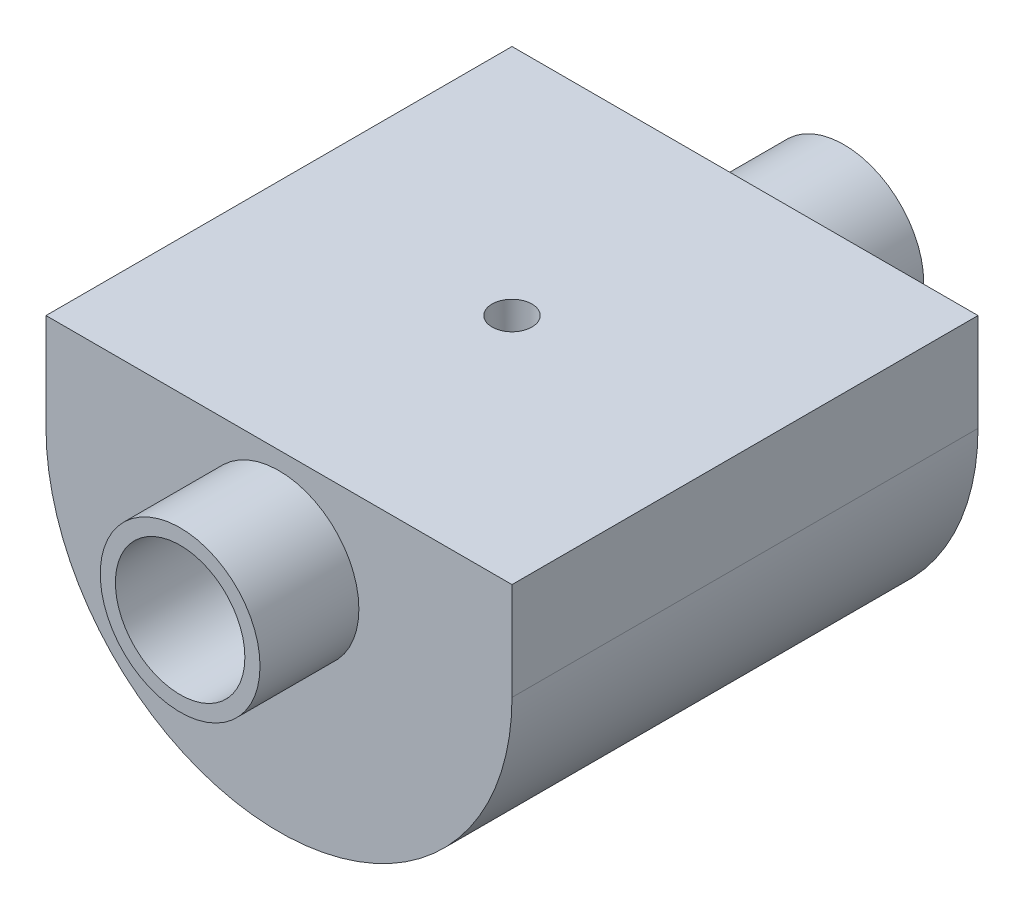
ISO-10303-21;
HEADER;
FILE_DESCRIPTION(('STEP AP214'),'2;1');
FILE_NAME('part.step','',(''),(''),'','','');
FILE_SCHEMA(('AUTOMOTIVE_DESIGN { 1 0 10303 214 1 1 1 1 }'));
ENDSEC;
DATA;
#1=APPLICATION_CONTEXT('core data for automotive mechanical design processes');
#2=APPLICATION_PROTOCOL_DEFINITION('international standard','automotive_design',2000,#1);
#3=PRODUCT_CONTEXT('',#1,'mechanical');
#4=PRODUCT('Part','Part','',(#3));
#5=PRODUCT_RELATED_PRODUCT_CATEGORY('part','',(#4));
#6=PRODUCT_DEFINITION_FORMATION('','',#4);
#7=PRODUCT_DEFINITION_CONTEXT('part definition',#1,'design');
#8=PRODUCT_DEFINITION('design','',#6,#7);
#9=PRODUCT_DEFINITION_SHAPE('','',#8);
#10=(LENGTH_UNIT() NAMED_UNIT(*) SI_UNIT(.MILLI.,.METRE.));
#11=(NAMED_UNIT(*) PLANE_ANGLE_UNIT() SI_UNIT($,.RADIAN.));
#12=(NAMED_UNIT(*) SI_UNIT($,.STERADIAN.) SOLID_ANGLE_UNIT());
#13=UNCERTAINTY_MEASURE_WITH_UNIT(LENGTH_MEASURE(1.E-05),#10,'distance_accuracy_value','');
#14=(GEOMETRIC_REPRESENTATION_CONTEXT(3) GLOBAL_UNCERTAINTY_ASSIGNED_CONTEXT((#13)) GLOBAL_UNIT_ASSIGNED_CONTEXT((#10,
#11,#12)) REPRESENTATION_CONTEXT('',''));
#15=CARTESIAN_POINT('',(0.,0.,0.));
#16=DIRECTION('',(0.,0.,1.));
#17=DIRECTION('',(1.,0.,0.));
#18=AXIS2_PLACEMENT_3D('',#15,#16,#17);
#19=CARTESIAN_POINT('',(0.,0.,35.));
#20=DIRECTION('',(0.,0.,1.));
#21=DIRECTION('',(1.,0.,0.));
#22=AXIS2_PLACEMENT_3D('',#19,#20,#21);
#23=PLANE('',#22);
#24=CARTESIAN_POINT('',(0.,0.,35.));
#25=DIRECTION('',(0.,0.,1.));
#26=DIRECTION('',(1.,0.,0.));
#27=AXIS2_PLACEMENT_3D('',#24,#25,#26);
#28=CIRCLE('',#27,6.);
#29=CARTESIAN_POINT('',(6.,0.,35.));
#30=VERTEX_POINT('',#29);
#31=EDGE_CURVE('E155',#30,#30,#28,.T.);
#32=ORIENTED_EDGE('',*,*,#31,.F.);
#33=EDGE_LOOP('',(#32));
#34=FACE_BOUND('',#33,.T.);
#35=DIRECTION('',(0.,1.,0.));
#36=VECTOR('',#35,1.);
#37=CARTESIAN_POINT('',(17.5,0.,35.));
#38=LINE('',#37,#36);
#39=CARTESIAN_POINT('',(17.5,0.,35.));
#40=VERTEX_POINT('',#39);
#41=CARTESIAN_POINT('',(17.5,7.33930506817735,35.));
#42=VERTEX_POINT('',#41);
#43=EDGE_CURVE('E158',#40,#42,#38,.T.);
#44=ORIENTED_EDGE('',*,*,#43,.T.);
#45=DIRECTION('',(-1.,0.,0.));
#46=VECTOR('',#45,1.);
#47=CARTESIAN_POINT('',(0.,7.33930506817735,35.));
#48=LINE('',#47,#46);
#49=CARTESIAN_POINT('',(-17.5,7.33930506817735,35.));
#50=VERTEX_POINT('',#49);
#51=EDGE_CURVE('E164',#42,#50,#48,.T.);
#52=ORIENTED_EDGE('',*,*,#51,.T.);
#53=DIRECTION('',(0.,-1.,0.));
#54=VECTOR('',#53,1.);
#55=CARTESIAN_POINT('',(-17.5,0.,35.));
#56=LINE('',#55,#54);
#57=CARTESIAN_POINT('',(-17.5,0.,35.));
#58=VERTEX_POINT('',#57);
#59=EDGE_CURVE('E79',#50,#58,#56,.T.);
#60=ORIENTED_EDGE('',*,*,#59,.T.);
#61=CARTESIAN_POINT('',(0.,0.,35.));
#62=DIRECTION('',(0.,0.,1.));
#63=DIRECTION('',(1.,0.,0.));
#64=AXIS2_PLACEMENT_3D('',#61,#62,#63);
#65=CIRCLE('',#64,17.5);
#66=EDGE_CURVE('E100',#58,#40,#65,.T.);
#67=ORIENTED_EDGE('',*,*,#66,.T.);
#68=EDGE_LOOP('',(#44,#52,#60,#67));
#69=FACE_BOUND('',#68,.T.);
#70=ADVANCED_FACE('F51',(#34,#69),#23,.T.);
#71=CARTESIAN_POINT('',(0.,0.,0.));
#72=DIRECTION('',(0.,0.,1.));
#73=DIRECTION('',(1.,0.,0.));
#74=AXIS2_PLACEMENT_3D('',#71,#72,#73);
#75=PLANE('',#74);
#76=CARTESIAN_POINT('',(0.,0.,0.));
#77=DIRECTION('',(0.,0.,1.));
#78=DIRECTION('',(1.,0.,0.));
#79=AXIS2_PLACEMENT_3D('',#76,#77,#78);
#80=CIRCLE('',#79,6.);
#81=CARTESIAN_POINT('',(6.,0.,0.));
#82=VERTEX_POINT('',#81);
#83=EDGE_CURVE('E176',#82,#82,#80,.T.);
#84=ORIENTED_EDGE('',*,*,#83,.T.);
#85=EDGE_LOOP('',(#84));
#86=FACE_BOUND('',#85,.T.);
#87=DIRECTION('',(-1.,0.,0.));
#88=VECTOR('',#87,1.);
#89=CARTESIAN_POINT('',(0.,7.33930506817735,0.));
#90=LINE('',#89,#88);
#91=CARTESIAN_POINT('',(17.5,7.33930506817735,0.));
#92=VERTEX_POINT('',#91);
#93=CARTESIAN_POINT('',(-17.5,7.33930506817735,0.));
#94=VERTEX_POINT('',#93);
#95=EDGE_CURVE('E70',#92,#94,#90,.T.);
#96=ORIENTED_EDGE('',*,*,#95,.F.);
#97=DIRECTION('',(0.,1.,0.));
#98=VECTOR('',#97,1.);
#99=CARTESIAN_POINT('',(17.5,0.,0.));
#100=LINE('',#99,#98);
#101=CARTESIAN_POINT('',(17.5,0.,0.));
#102=VERTEX_POINT('',#101);
#103=EDGE_CURVE('E101',#102,#92,#100,.T.);
#104=ORIENTED_EDGE('',*,*,#103,.F.);
#105=CARTESIAN_POINT('',(0.,0.,0.));
#106=DIRECTION('',(0.,0.,1.));
#107=DIRECTION('',(1.,0.,0.));
#108=AXIS2_PLACEMENT_3D('',#105,#106,#107);
#109=CIRCLE('',#108,17.5);
#110=CARTESIAN_POINT('',(-17.5,0.,0.));
#111=VERTEX_POINT('',#110);
#112=EDGE_CURVE('E107',#111,#102,#109,.T.);
#113=ORIENTED_EDGE('',*,*,#112,.F.);
#114=DIRECTION('',(0.,-1.,0.));
#115=VECTOR('',#114,1.);
#116=CARTESIAN_POINT('',(-17.5,0.,0.));
#117=LINE('',#116,#115);
#118=EDGE_CURVE('E92',#94,#111,#117,.T.);
#119=ORIENTED_EDGE('',*,*,#118,.F.);
#120=EDGE_LOOP('',(#96,#104,#113,#119));
#121=FACE_BOUND('',#120,.T.);
#122=ADVANCED_FACE('F110',(#86,#121),#75,.F.);
#123=CARTESIAN_POINT('',(17.5,0.,35.));
#124=DIRECTION('',(-1.,0.,0.));
#125=DIRECTION('',(0.,0.,1.));
#126=AXIS2_PLACEMENT_3D('',#123,#124,#125);
#127=PLANE('',#126);
#128=DIRECTION('',(0.,0.,-1.));
#129=VECTOR('',#128,1.);
#130=CARTESIAN_POINT('',(17.5,7.33930506817735,35.));
#131=LINE('',#130,#129);
#132=EDGE_CURVE('E169',#42,#92,#131,.T.);
#133=ORIENTED_EDGE('',*,*,#132,.F.);
#134=ORIENTED_EDGE('',*,*,#43,.F.);
#135=DIRECTION('',(0.,0.,-1.));
#136=VECTOR('',#135,1.);
#137=CARTESIAN_POINT('',(17.5,0.,35.));
#138=LINE('',#137,#136);
#139=EDGE_CURVE('E11',#40,#102,#138,.T.);
#140=ORIENTED_EDGE('',*,*,#139,.T.);
#141=ORIENTED_EDGE('',*,*,#103,.T.);
#142=EDGE_LOOP('',(#133,#134,#140,#141));
#143=FACE_BOUND('',#142,.T.);
#144=ADVANCED_FACE('F168',(#143),#127,.F.);
#145=CARTESIAN_POINT('',(-17.5,0.,35.));
#146=DIRECTION('',(1.,0.,0.));
#147=DIRECTION('',(0.,0.,-1.));
#148=AXIS2_PLACEMENT_3D('',#145,#146,#147);
#149=PLANE('',#148);
#150=DIRECTION('',(0.,0.,1.));
#151=VECTOR('',#150,1.);
#152=CARTESIAN_POINT('',(-17.5,7.33930506817735,35.));
#153=LINE('',#152,#151);
#154=EDGE_CURVE('E96',#94,#50,#153,.T.);
#155=ORIENTED_EDGE('',*,*,#154,.F.);
#156=ORIENTED_EDGE('',*,*,#118,.T.);
#157=DIRECTION('',(0.,0.,-1.));
#158=VECTOR('',#157,1.);
#159=CARTESIAN_POINT('',(-17.5,0.,35.));
#160=LINE('',#159,#158);
#161=EDGE_CURVE('E62',#58,#111,#160,.T.);
#162=ORIENTED_EDGE('',*,*,#161,.F.);
#163=ORIENTED_EDGE('',*,*,#59,.F.);
#164=EDGE_LOOP('',(#155,#156,#162,#163));
#165=FACE_BOUND('',#164,.T.);
#166=ADVANCED_FACE('F94',(#165),#149,.F.);
#167=CARTESIAN_POINT('',(0.,79.,17.5));
#168=DIRECTION('',(0.,-1.,0.));
#169=DIRECTION('',(0.,0.,-1.));
#170=AXIS2_PLACEMENT_3D('',#167,#168,#169);
#171=CYLINDRICAL_SURFACE('',#170,1.5);
#172=CARTESIAN_POINT('',(0.,4.8625,16.));
#173=CARTESIAN_POINT('',(-0.0821795746831073,4.8624994882997,16.0000006909281));
#174=CARTESIAN_POINT('',(-0.164366228022962,4.86039691664784,16.0067757817756));
#175=CARTESIAN_POINT('',(-0.326339340980585,4.85221514441543,16.0336282920363));
#176=CARTESIAN_POINT('',(-0.40612519626952,4.84613495120348,16.0537090319437));
#177=CARTESIAN_POINT('',(-0.560937451826619,4.83066280592235,16.1064336045222));
#178=CARTESIAN_POINT('',(-0.635970905342572,4.82127590414352,16.1390582859166));
#179=CARTESIAN_POINT('',(-0.779502348236602,4.80016164286946,16.2158641217591));
#180=CARTESIAN_POINT('',(-0.847999356948353,4.78843393299497,16.260047006582));
#181=CARTESIAN_POINT('',(-0.978581003475729,4.7634890468495,16.360119165403));
#182=CARTESIAN_POINT('',(-1.04044063066434,4.75024004066703,16.4162940890421));
#183=CARTESIAN_POINT('',(-1.15402742993811,4.72393195132306,16.5381473242581));
#184=CARTESIAN_POINT('',(-1.20575277592007,4.71087290278189,16.6038273448648));
#185=CARTESIAN_POINT('',(-1.29881104638105,4.68608334357065,16.7447599463021));
#186=CARTESIAN_POINT('',(-1.33986497881649,4.67439220643086,16.8202043272259));
#187=CARTESIAN_POINT('',(-1.4086096820711,4.6541399420521,16.9773452409859));
#188=CARTESIAN_POINT('',(-1.43630387112843,4.64557801430631,17.059040168346));
#189=CARTESIAN_POINT('',(-1.47672349779256,4.63288611935535,17.2238280413123));
#190=CARTESIAN_POINT('',(-1.4898655030265,4.62863312821255,17.3068090741103));
#191=CARTESIAN_POINT('',(-1.50210892373973,4.62467514654074,17.4738988112305));
#192=CARTESIAN_POINT('',(-1.50121396309753,4.62496898217177,17.5580072188997));
#193=CARTESIAN_POINT('',(-1.48573511821575,4.62996271841591,17.7215374552996));
#194=CARTESIAN_POINT('',(-1.4716782671796,4.6344929739069,17.8010152181805));
#195=CARTESIAN_POINT('',(-1.43112819877137,4.64717388262663,17.9564242986393));
#196=CARTESIAN_POINT('',(-1.40463369046194,4.65532491166031,18.0323552471841));
#197=CARTESIAN_POINT('',(-1.3395830181187,4.6744607077735,18.1797817153919));
#198=CARTESIAN_POINT('',(-1.30085960053564,4.68548437415353,18.2511981703781));
#199=CARTESIAN_POINT('',(-1.21256650935362,4.70910524905967,18.3866935207565));
#200=CARTESIAN_POINT('',(-1.16299407907604,4.72170285716657,18.4507705449215));
#201=CARTESIAN_POINT('',(-1.05181377873494,4.74773517599333,18.5727508387473));
#202=CARTESIAN_POINT('',(-0.98977007594019,4.7611822495714,18.6302549409554));
#203=CARTESIAN_POINT('',(-0.856752576393521,4.78690546964915,18.7341380243622));
#204=CARTESIAN_POINT('',(-0.785778151914691,4.7991815337336,18.7805162228713));
#205=CARTESIAN_POINT('',(-0.63615891488519,4.82130287061326,18.8610922514201));
#206=CARTESIAN_POINT('',(-0.557461040335191,4.83112940921516,18.8951970421205));
#207=CARTESIAN_POINT('',(-0.395072059537548,4.84710936144749,18.949566690899));
#208=CARTESIAN_POINT('',(-0.311382437137971,4.85326386070247,18.969835639747));
#209=CARTESIAN_POINT('',(-0.144775518795572,4.86103256652565,18.9952833000308));
#210=CARTESIAN_POINT('',(-0.0619482488903989,4.86280933863254,19.0010025839047));
#211=CARTESIAN_POINT('',(0.103490243047512,4.86210193415316,18.9987097795244));
#212=CARTESIAN_POINT('',(0.18610149408194,4.85961836243137,18.9906996405122));
#213=CARTESIAN_POINT('',(0.346692415000108,4.85077602389645,18.9616103806395));
#214=CARTESIAN_POINT('',(0.424735732242307,4.84451213914449,18.9408510341761));
#215=CARTESIAN_POINT('',(0.576211389798628,4.82883939282172,18.8872410540468));
#216=CARTESIAN_POINT('',(0.649643163913741,4.81943014596088,18.8543889390316));
#217=CARTESIAN_POINT('',(0.791769567537947,4.7981556975198,18.7766437599875));
#218=CARTESIAN_POINT('',(0.860308323768272,4.78623700063068,18.7314807815432));
#219=CARTESIAN_POINT('',(0.989016547970286,4.76130836574981,18.6307210558488));
#220=CARTESIAN_POINT('',(1.04918379410136,4.74829813952377,18.5751215478545));
#221=CARTESIAN_POINT('',(1.16184727696435,4.72202243412747,18.4525252090149));
#222=CARTESIAN_POINT('',(1.21395842711516,4.7087664467203,18.3851716642402));
#223=CARTESIAN_POINT('',(1.30617063946362,4.68402730640107,18.2423877011408));
#224=CARTESIAN_POINT('',(1.34627193609245,4.67254411888623,18.1669574405119));
#225=CARTESIAN_POINT('',(1.4130678765921,4.65277993737621,18.0103462367915));
#226=CARTESIAN_POINT('',(1.43981814493778,4.64448569104761,17.9291907888409));
#227=CARTESIAN_POINT('',(1.4791827936952,4.6321008856001,17.7632205950238));
#228=CARTESIAN_POINT('',(1.49180237668866,4.62800877939935,17.6784072078753));
#229=CARTESIAN_POINT('',(1.50218020842849,4.62464994866724,17.5115460617706));
#230=CARTESIAN_POINT('',(1.50056887180932,4.62517852199942,17.4295411380066));
#231=CARTESIAN_POINT('',(1.48404690541886,4.63050587735585,17.2670306787278));
#232=CARTESIAN_POINT('',(1.46913686671097,4.63530446959826,17.1865250767378));
#233=CARTESIAN_POINT('',(1.42685793021891,4.64848998265936,17.0303942595161));
#234=CARTESIAN_POINT('',(1.39966503864634,4.65682611381004,16.954716772214));
#235=CARTESIAN_POINT('',(1.3337303357396,4.67613562026954,16.80893791658));
#236=CARTESIAN_POINT('',(1.29498621899808,4.68710952194297,16.738837664901));
#237=CARTESIAN_POINT('',(1.20531477769649,4.71098190639481,16.6033009963306));
#238=CARTESIAN_POINT('',(1.15397809675077,4.72393795286873,16.5381455688768));
#239=CARTESIAN_POINT('',(1.04130445431691,4.75004534446928,16.4171699757111));
#240=CARTESIAN_POINT('',(0.979964844727616,4.76319674047104,16.3613522899523));
#241=CARTESIAN_POINT('',(0.846699112263249,4.78871028241877,16.2588776659746));
#242=CARTESIAN_POINT('',(0.774500211231539,4.80103447725481,16.2125649918607));
#243=CARTESIAN_POINT('',(0.622961158198044,4.82303569787462,16.1327972312869));
#244=CARTESIAN_POINT('',(0.543624006186833,4.83271382887588,16.099336774295));
#245=CARTESIAN_POINT('',(0.387592786980805,4.84760210324046,16.0488397421338));
#246=CARTESIAN_POINT('',(0.311325681586962,4.85314107429208,16.0305765691596));
#247=CARTESIAN_POINT('',(0.156707596228359,4.86058992119698,16.0061575210975));
#248=CARTESIAN_POINT('',(0.0783570158386625,4.86250048789871,15.9999993412102));
#249=CARTESIAN_POINT('',(0.,4.8625,16.));
#250=B_SPLINE_CURVE_WITH_KNOTS('',3,(#172,#173,#174,#175,#176,#177,#178,#179,#180,#181,#182,
#183,#184,#185,#186,#187,#188,#189,#190,#191,#192,#193,#194,#195,#196,#197,#198,#199,#200,#201,
#202,#203,#204,#205,#206,#207,#208,#209,#210,#211,#212,#213,#214,#215,#216,#217,#218,#219,#220,
#221,#222,#223,#224,#225,#226,#227,#228,#229,#230,#231,#232,#233,#234,#235,#236,#237,#238,#239,
#240,#241,#242,#243,#244,#245,#246,#247,#248,#249),.UNSPECIFIED.,.T.,.F.,(4,2,2,2,2,2,2,2,2,2,2,
2,2,2,2,2,2,2,2,2,2,2,2,2,2,2,2,2,2,2,2,2,2,2,2,2,2,2,4),(0.,0.246250771591372,
0.492563019503995,0.738500697567161,0.984475215971041,1.2371382350503,1.48984673986839,
1.74861593297693,2.00731888196168,2.25840773964248,2.5094317755844,2.75081541450365,
2.99222411281066,3.23708900766972,3.48201619383398,3.73779199282308,3.99358577995893,
4.25127969550536,4.50889738701947,4.756793800888,5.00465502245048,5.24653984917081,
5.48845431635297,5.7361713661488,5.98395403638721,6.24128781216383,6.49861656448256,
6.75486406507971,7.01101719039871,7.25588192796224,7.5007357830072,7.74218717180106,
7.98368678204738,8.23442463650505,8.485228977523,8.74393989557211,9.00254258865459,
9.23738379600397,9.47218028508624),.UNSPECIFIED.);
#251=CARTESIAN_POINT('',(0.,4.8625,16.));
#252=VERTEX_POINT('',#251);
#253=EDGE_CURVE('E119',#252,#252,#250,.T.);
#254=ORIENTED_EDGE('',*,*,#253,.F.);
#255=EDGE_LOOP('',(#254));
#256=FACE_BOUND('',#255,.T.);
#257=CARTESIAN_POINT('',(0.,7.33930506817734,17.5));
#258=DIRECTION('',(0.,1.,0.));
#259=DIRECTION('',(0.,0.,1.));
#260=AXIS2_PLACEMENT_3D('',#257,#258,#259);
#261=CIRCLE('',#260,1.5);
#262=CARTESIAN_POINT('',(0.,7.33930506817734,19.));
#263=VERTEX_POINT('',#262);
#264=EDGE_CURVE('E56',#263,#263,#261,.T.);
#265=ORIENTED_EDGE('',*,*,#264,.T.);
#266=EDGE_LOOP('',(#265));
#267=FACE_BOUND('',#266,.T.);
#268=ADVANCED_FACE('F145',(#256,#267),#171,.F.);
#269=CARTESIAN_POINT('',(0.,0.,35.));
#270=DIRECTION('',(0.,0.,-1.));
#271=DIRECTION('',(-1.,0.,0.));
#272=AXIS2_PLACEMENT_3D('',#269,#270,#271);
#273=CYLINDRICAL_SURFACE('',#272,17.5);
#274=ORIENTED_EDGE('',*,*,#112,.T.);
#275=ORIENTED_EDGE('',*,*,#139,.F.);
#276=ORIENTED_EDGE('',*,*,#66,.F.);
#277=ORIENTED_EDGE('',*,*,#161,.T.);
#278=EDGE_LOOP('',(#274,#275,#276,#277));
#279=FACE_BOUND('',#278,.T.);
#280=CARTESIAN_POINT('',(0.,-17.5,16.));
#281=CARTESIAN_POINT('',(0.0840900887107122,-17.4999991594733,16.0000036689457));
#282=CARTESIAN_POINT('',(0.168237205347032,-17.4993874435045,16.0070949311434));
#283=CARTESIAN_POINT('',(0.334202638193609,-17.4970060027991,16.0352786168854));
#284=CARTESIAN_POINT('',(0.416018216761204,-17.4952349709134,16.0563868451961));
#285=CARTESIAN_POINT('',(0.574892903023322,-17.4907350049708,16.1119890345756));
#286=CARTESIAN_POINT('',(0.651954696953219,-17.4880066178289,16.1464753542347));
#287=CARTESIAN_POINT('',(0.799177678621248,-17.4818977976165,16.2278409579791));
#288=CARTESIAN_POINT('',(0.869340324379601,-17.478517502765,16.2747176158163));
#289=CARTESIAN_POINT('',(1.00098012086048,-17.4714739349038,16.3796691444747));
#290=CARTESIAN_POINT('',(1.0624361682522,-17.4678100065351,16.4377704433997));
#291=CARTESIAN_POINT('',(1.17473714274468,-17.4606176074471,16.563466044678));
#292=CARTESIAN_POINT('',(1.22558160053927,-17.4570891427244,16.6310607666644));
#293=CARTESIAN_POINT('',(1.31528804394571,-17.4505601834405,16.7739528804713));
#294=CARTESIAN_POINT('',(1.3541313994292,-17.447560512831,16.8492620089996));
#295=CARTESIAN_POINT('',(1.41861401911449,-17.4424363752803,17.0053634479112));
#296=CARTESIAN_POINT('',(1.44425352872523,-17.4403118920728,17.0861556563534));
#297=CARTESIAN_POINT('',(1.48153922884676,-17.4371842440243,17.2507178221446));
#298=CARTESIAN_POINT('',(1.49321989768765,-17.4361783167802,17.3344799141938));
#299=CARTESIAN_POINT('',(1.50236286720603,-17.4353929686056,17.5027813421651));
#300=CARTESIAN_POINT('',(1.49982544877632,-17.4356135234446,17.5873206626993));
#301=CARTESIAN_POINT('',(1.48063275656642,-17.4372537073855,17.7545403249538));
#302=CARTESIAN_POINT('',(1.4640149768294,-17.4386701519636,17.8372250056695));
#303=CARTESIAN_POINT('',(1.41719154226227,-17.4425375250173,17.9986272506223));
#304=CARTESIAN_POINT('',(1.38698574798361,-17.4449884641096,18.0773447741367));
#305=CARTESIAN_POINT('',(1.31380181438494,-17.4506523313746,18.2286975511954));
#306=CARTESIAN_POINT('',(1.27080687785469,-17.4538662605277,18.3013246437703));
#307=CARTESIAN_POINT('',(1.17327723208652,-17.4606930646245,18.4383456880876));
#308=CARTESIAN_POINT('',(1.11874227540577,-17.4643059481219,18.5027394632424));
#309=CARTESIAN_POINT('',(0.999470458872472,-17.4715377484946,18.6216839608819));
#310=CARTESIAN_POINT('',(0.934701189276641,-17.4751566471183,18.6762021908343));
#311=CARTESIAN_POINT('',(0.79691230790879,-17.4819816038833,18.7735967185387));
#312=CARTESIAN_POINT('',(0.723892690194866,-17.4851876617273,18.8164730079061));
#313=CARTESIAN_POINT('',(0.571654568400851,-17.4908263664502,18.8893646259496));
#314=CARTESIAN_POINT('',(0.492435358600528,-17.4932589251192,18.9193784879269));
#315=CARTESIAN_POINT('',(0.330056610564175,-17.497075554016,18.9656703783274));
#316=CARTESIAN_POINT('',(0.246897158890749,-17.4984596472661,18.9819487083569));
#317=CARTESIAN_POINT('',(0.0792801254169862,-17.5000204405764,19.0002666510449));
#318=CARTESIAN_POINT('',(-0.00517251833806386,-17.50020094583,19.0023511385692));
#319=CARTESIAN_POINT('',(-0.173226052241328,-17.4993443933604,18.9923398221173));
#320=CARTESIAN_POINT('',(-0.256826950793807,-17.4983073476627,18.9802441581954));
#321=CARTESIAN_POINT('',(-0.420675710779482,-17.4951347543422,18.9422530888318));
#322=CARTESIAN_POINT('',(-0.500928436352368,-17.4930008648631,18.9163785114185));
#323=CARTESIAN_POINT('',(-0.655953511227377,-17.4878742551377,18.8515853899672));
#324=CARTESIAN_POINT('',(-0.730725769009281,-17.4848815205533,18.8126666281603));
#325=CARTESIAN_POINT('',(-0.872871440837198,-17.4783631237428,18.7227773235277));
#326=CARTESIAN_POINT('',(-0.940226014804558,-17.4748361561913,18.6717770842366));
#327=CARTESIAN_POINT('',(-1.06543412084655,-17.467649837578,18.5592153900378));
#328=CARTESIAN_POINT('',(-1.1232874782242,-17.4639904840836,18.4976537409819));
#329=CARTESIAN_POINT('',(-1.22800508301078,-17.4569405366366,18.3655218651305));
#330=CARTESIAN_POINT('',(-1.27484002450932,-17.4535506749448,18.2949283682188));
#331=CARTESIAN_POINT('',(-1.35599031614564,-17.4474340063892,18.146852377489));
#332=CARTESIAN_POINT('',(-1.39030579747788,-17.4447071925772,18.0693699558722));
#333=CARTESIAN_POINT('',(-1.4453932712282,-17.4402295391797,17.909818894438));
#334=CARTESIAN_POINT('',(-1.46618313697926,-17.4384774120469,17.827756463278));
#335=CARTESIAN_POINT('',(-1.49368739816738,-17.4361432515205,17.6612899713111));
#336=CARTESIAN_POINT('',(-1.5004020813581,-17.435561194206,17.5768859584113));
#337=CARTESIAN_POINT('',(-1.49956196176542,-17.4356334475388,17.4084234676048));
#338=CARTESIAN_POINT('',(-1.49205320334771,-17.4362837687124,17.3243647545355));
#339=CARTESIAN_POINT('',(-1.46307542778588,-17.4387390238802,17.1587070362759));
#340=CARTESIAN_POINT('',(-1.44160638999741,-17.4405439595818,17.0771080347231));
#341=CARTESIAN_POINT('',(-1.3853292896036,-17.4451040158272,16.9186834892131));
#342=CARTESIAN_POINT('',(-1.35052212863537,-17.447859072143,16.8418576230068));
#343=CARTESIAN_POINT('',(-1.26856192068809,-17.4540090548504,16.6951322121013));
#344=CARTESIAN_POINT('',(-1.2214090509481,-17.4574039720557,16.6252325679868));
#345=CARTESIAN_POINT('',(-1.11592285951566,-17.4644642414072,16.4941080770302));
#346=CARTESIAN_POINT('',(-1.05755540365527,-17.4681303976252,16.4329107334915));
#347=CARTESIAN_POINT('',(-0.931359803734685,-17.4753127111157,16.3211559866165));
#348=CARTESIAN_POINT('',(-0.863529377072589,-17.4788288319294,16.2706011578086));
#349=CARTESIAN_POINT('',(-0.720195326926259,-17.4853216091624,16.1814945857793));
#350=CARTESIAN_POINT('',(-0.644677026557885,-17.4882972023409,16.1429663948272));
#351=CARTESIAN_POINT('',(-0.488268737743218,-17.4933613340228,16.0791866111664));
#352=CARTESIAN_POINT('',(-0.407385029028376,-17.4954508890876,16.0539197955746));
#353=CARTESIAN_POINT('',(-0.271688875746324,-17.4979725842776,16.0237972528464));
#354=CARTESIAN_POINT('',(-0.217748455496352,-17.4987293930011,16.0148851877734));
#355=CARTESIAN_POINT('',(-0.109213375322047,-17.4997433731255,16.0029853782167));
#356=CARTESIAN_POINT('',(-0.0546187172544694,-17.5000005459441,15.9999976169236));
#357=CARTESIAN_POINT('',(0.,-17.5,16.));
#358=B_SPLINE_CURVE_WITH_KNOTS('',3,(#280,#281,#282,#283,#284,#285,#286,#287,#288,#289,#290,
#291,#292,#293,#294,#295,#296,#297,#298,#299,#300,#301,#302,#303,#304,#305,#306,#307,#308,#309,
#310,#311,#312,#313,#314,#315,#316,#317,#318,#319,#320,#321,#322,#323,#324,#325,#326,#327,#328,
#329,#330,#331,#332,#333,#334,#335,#336,#337,#338,#339,#340,#341,#342,#343,#344,#345,#346,#347,
#348,#349,#350,#351,#352,#353,#354,#355,#356,#357),.UNSPECIFIED.,.T.,.F.,(4,2,2,2,2,2,2,2,2,2,2,
2,2,2,2,2,2,2,2,2,2,2,2,2,2,2,2,2,2,2,2,2,2,2,2,2,2,2,4),(0.,0.252070844310373,
0.504426393652047,0.756638012182107,1.0087962149074,1.26155551650305,1.51432599421665,
1.76748691573707,2.02064313179525,2.27317275110476,2.525697381452,2.77755167951108,
3.02940856231232,3.28159770462397,3.53379225496101,3.78680207360298,4.03981207446395,
4.29285091830753,4.54588420575254,4.79811713708821,5.0503475771986,5.30219782677344,
5.55405228112454,5.80653234151375,6.05901704368433,6.31216587866227,6.5653120607557,
6.81812304140249,7.07092885351994,7.32291767673277,7.57490687258536,7.82687903735057,
8.07884758491874,8.33159556665816,8.58440462052468,8.83770569919966,9.09071537122188,
9.25444245783791,9.41816907989973),.UNSPECIFIED.);
#359=CARTESIAN_POINT('',(0.,-17.5,16.));
#360=VERTEX_POINT('',#359);
#361=EDGE_CURVE('E113',#360,#360,#358,.T.);
#362=ORIENTED_EDGE('',*,*,#361,.F.);
#363=EDGE_LOOP('',(#362));
#364=FACE_BOUND('',#363,.T.);
#365=ADVANCED_FACE('F53',(#279,#364),#273,.T.);
#366=CARTESIAN_POINT('',(0.,0.,35.));
#367=DIRECTION('',(0.,0.,-1.));
#368=DIRECTION('',(-1.,0.,0.));
#369=AXIS2_PLACEMENT_3D('',#366,#367,#368);
#370=CYLINDRICAL_SURFACE('',#369,4.8625);
#371=CARTESIAN_POINT('',(0.,-4.8625,16.));
#372=CARTESIAN_POINT('',(0.0821795746831073,-4.8624994882997,16.0000006909281));
#373=CARTESIAN_POINT('',(0.164366228022962,-4.86039691664784,16.0067757817756));
#374=CARTESIAN_POINT('',(0.326339340980585,-4.85221514441543,16.0336282920363));
#375=CARTESIAN_POINT('',(0.40612519626952,-4.84613495120348,16.0537090319437));
#376=CARTESIAN_POINT('',(0.560937451826619,-4.83066280592235,16.1064336045222));
#377=CARTESIAN_POINT('',(0.635970905342572,-4.82127590414352,16.1390582859166));
#378=CARTESIAN_POINT('',(0.779502348236602,-4.80016164286946,16.2158641217591));
#379=CARTESIAN_POINT('',(0.847999356948353,-4.78843393299497,16.260047006582));
#380=CARTESIAN_POINT('',(0.978581003475729,-4.7634890468495,16.360119165403));
#381=CARTESIAN_POINT('',(1.04044063066434,-4.75024004066703,16.4162940890421));
#382=CARTESIAN_POINT('',(1.15402742993811,-4.72393195132306,16.5381473242581));
#383=CARTESIAN_POINT('',(1.20575277592007,-4.71087290278189,16.6038273448648));
#384=CARTESIAN_POINT('',(1.29881104638105,-4.68608334357065,16.7447599463021));
#385=CARTESIAN_POINT('',(1.33986497881649,-4.67439220643086,16.8202043272259));
#386=CARTESIAN_POINT('',(1.4086096820711,-4.6541399420521,16.9773452409859));
#387=CARTESIAN_POINT('',(1.43630387112843,-4.64557801430631,17.059040168346));
#388=CARTESIAN_POINT('',(1.47672349779256,-4.63288611935535,17.2238280413123));
#389=CARTESIAN_POINT('',(1.4898655030265,-4.62863312821255,17.3068090741103));
#390=CARTESIAN_POINT('',(1.50210892373973,-4.62467514654074,17.4738988112305));
#391=CARTESIAN_POINT('',(1.50121396309753,-4.62496898217177,17.5580072188997));
#392=CARTESIAN_POINT('',(1.48573511821575,-4.62996271841591,17.7215374552996));
#393=CARTESIAN_POINT('',(1.4716782671796,-4.6344929739069,17.8010152181805));
#394=CARTESIAN_POINT('',(1.43112819877137,-4.64717388262663,17.9564242986393));
#395=CARTESIAN_POINT('',(1.40463369046194,-4.65532491166031,18.0323552471841));
#396=CARTESIAN_POINT('',(1.3395830181187,-4.6744607077735,18.1797817153919));
#397=CARTESIAN_POINT('',(1.30085960053564,-4.68548437415353,18.2511981703781));
#398=CARTESIAN_POINT('',(1.21256650935362,-4.70910524905967,18.3866935207565));
#399=CARTESIAN_POINT('',(1.16299407907604,-4.72170285716657,18.4507705449215));
#400=CARTESIAN_POINT('',(1.05181377873494,-4.74773517599333,18.5727508387473));
#401=CARTESIAN_POINT('',(0.98977007594019,-4.7611822495714,18.6302549409554));
#402=CARTESIAN_POINT('',(0.856752576393521,-4.78690546964915,18.7341380243622));
#403=CARTESIAN_POINT('',(0.785778151914691,-4.7991815337336,18.7805162228713));
#404=CARTESIAN_POINT('',(0.63615891488519,-4.82130287061326,18.8610922514201));
#405=CARTESIAN_POINT('',(0.557461040335191,-4.83112940921516,18.8951970421205));
#406=CARTESIAN_POINT('',(0.395072059537548,-4.84710936144749,18.949566690899));
#407=CARTESIAN_POINT('',(0.311382437137971,-4.85326386070247,18.969835639747));
#408=CARTESIAN_POINT('',(0.144775518795572,-4.86103256652565,18.9952833000308));
#409=CARTESIAN_POINT('',(0.0619482488903989,-4.86280933863254,19.0010025839047));
#410=CARTESIAN_POINT('',(-0.103490243047512,-4.86210193415316,18.9987097795244));
#411=CARTESIAN_POINT('',(-0.18610149408194,-4.85961836243137,18.9906996405122));
#412=CARTESIAN_POINT('',(-0.346692415000108,-4.85077602389645,18.9616103806395));
#413=CARTESIAN_POINT('',(-0.424735732242307,-4.84451213914449,18.9408510341761));
#414=CARTESIAN_POINT('',(-0.576211389798628,-4.82883939282172,18.8872410540468));
#415=CARTESIAN_POINT('',(-0.649643163913741,-4.81943014596088,18.8543889390316));
#416=CARTESIAN_POINT('',(-0.791769567537947,-4.7981556975198,18.7766437599875));
#417=CARTESIAN_POINT('',(-0.860308323768272,-4.78623700063068,18.7314807815432));
#418=CARTESIAN_POINT('',(-0.989016547970286,-4.76130836574981,18.6307210558488));
#419=CARTESIAN_POINT('',(-1.04918379410136,-4.74829813952377,18.5751215478545));
#420=CARTESIAN_POINT('',(-1.16184727696435,-4.72202243412747,18.4525252090149));
#421=CARTESIAN_POINT('',(-1.21395842711516,-4.7087664467203,18.3851716642402));
#422=CARTESIAN_POINT('',(-1.30617063946362,-4.68402730640107,18.2423877011408));
#423=CARTESIAN_POINT('',(-1.34627193609245,-4.67254411888623,18.1669574405119));
#424=CARTESIAN_POINT('',(-1.4130678765921,-4.65277993737621,18.0103462367915));
#425=CARTESIAN_POINT('',(-1.43981814493778,-4.64448569104761,17.9291907888409));
#426=CARTESIAN_POINT('',(-1.4791827936952,-4.6321008856001,17.7632205950238));
#427=CARTESIAN_POINT('',(-1.49180237668866,-4.62800877939935,17.6784072078753));
#428=CARTESIAN_POINT('',(-1.50218020842849,-4.62464994866724,17.5115460617706));
#429=CARTESIAN_POINT('',(-1.50056887180932,-4.62517852199942,17.4295411380066));
#430=CARTESIAN_POINT('',(-1.48404690541886,-4.63050587735585,17.2670306787278));
#431=CARTESIAN_POINT('',(-1.46913686671097,-4.63530446959826,17.1865250767378));
#432=CARTESIAN_POINT('',(-1.42685793021891,-4.64848998265936,17.0303942595161));
#433=CARTESIAN_POINT('',(-1.39966503864634,-4.65682611381004,16.954716772214));
#434=CARTESIAN_POINT('',(-1.3337303357396,-4.67613562026954,16.80893791658));
#435=CARTESIAN_POINT('',(-1.29498621899808,-4.68710952194297,16.738837664901));
#436=CARTESIAN_POINT('',(-1.20531477769649,-4.71098190639481,16.6033009963306));
#437=CARTESIAN_POINT('',(-1.15397809675077,-4.72393795286873,16.5381455688768));
#438=CARTESIAN_POINT('',(-1.04130445431691,-4.75004534446928,16.4171699757111));
#439=CARTESIAN_POINT('',(-0.979964844727616,-4.76319674047104,16.3613522899523));
#440=CARTESIAN_POINT('',(-0.846699112263249,-4.78871028241877,16.2588776659746));
#441=CARTESIAN_POINT('',(-0.774500211231539,-4.80103447725481,16.2125649918607));
#442=CARTESIAN_POINT('',(-0.622961158198044,-4.82303569787462,16.1327972312869));
#443=CARTESIAN_POINT('',(-0.543624006186833,-4.83271382887588,16.099336774295));
#444=CARTESIAN_POINT('',(-0.387592786980805,-4.84760210324046,16.0488397421338));
#445=CARTESIAN_POINT('',(-0.311325681586962,-4.85314107429208,16.0305765691596));
#446=CARTESIAN_POINT('',(-0.156707596228359,-4.86058992119698,16.0061575210975));
#447=CARTESIAN_POINT('',(-0.0783570158386625,-4.86250048789871,15.9999993412102));
#448=CARTESIAN_POINT('',(0.,-4.8625,16.));
#449=B_SPLINE_CURVE_WITH_KNOTS('',3,(#371,#372,#373,#374,#375,#376,#377,#378,#379,#380,#381,
#382,#383,#384,#385,#386,#387,#388,#389,#390,#391,#392,#393,#394,#395,#396,#397,#398,#399,#400,
#401,#402,#403,#404,#405,#406,#407,#408,#409,#410,#411,#412,#413,#414,#415,#416,#417,#418,#419,
#420,#421,#422,#423,#424,#425,#426,#427,#428,#429,#430,#431,#432,#433,#434,#435,#436,#437,#438,
#439,#440,#441,#442,#443,#444,#445,#446,#447,#448),.UNSPECIFIED.,.T.,.F.,(4,2,2,2,2,2,2,2,2,2,2,
2,2,2,2,2,2,2,2,2,2,2,2,2,2,2,2,2,2,2,2,2,2,2,2,2,2,2,4),(0.,0.246250771591372,
0.492563019503995,0.738500697567161,0.984475215971041,1.2371382350503,1.48984673986839,
1.74861593297693,2.00731888196168,2.25840773964248,2.5094317755844,2.75081541450365,
2.99222411281066,3.23708900766972,3.48201619383398,3.73779199282308,3.99358577995893,
4.25127969550536,4.50889738701947,4.756793800888,5.00465502245048,5.24653984917081,
5.48845431635297,5.7361713661488,5.98395403638721,6.24128781216383,6.49861656448256,
6.75486406507971,7.01101719039871,7.25588192796224,7.5007357830072,7.74218717180106,
7.98368678204738,8.23442463650505,8.485228977523,8.74393989557211,9.00254258865459,
9.23738379600397,9.47218028508624),.UNSPECIFIED.);
#450=CARTESIAN_POINT('',(0.,-4.8625,16.));
#451=VERTEX_POINT('',#450);
#452=EDGE_CURVE('E124',#451,#451,#449,.T.);
#453=ORIENTED_EDGE('',*,*,#452,.T.);
#454=EDGE_LOOP('',(#453));
#455=FACE_BOUND('',#454,.T.);
#456=ORIENTED_EDGE('',*,*,#253,.T.);
#457=EDGE_LOOP('',(#456));
#458=FACE_BOUND('',#457,.T.);
#459=CARTESIAN_POINT('',(0.,0.,42.4252));
#460=DIRECTION('',(0.,0.,1.));
#461=DIRECTION('',(1.,0.,0.));
#462=AXIS2_PLACEMENT_3D('',#459,#460,#461);
#463=CIRCLE('',#462,4.8625);
#464=CARTESIAN_POINT('',(4.8625,0.,42.4252));
#465=VERTEX_POINT('',#464);
#466=EDGE_CURVE('E185',#465,#465,#463,.T.);
#467=ORIENTED_EDGE('',*,*,#466,.T.);
#468=EDGE_LOOP('',(#467));
#469=FACE_BOUND('',#468,.T.);
#470=CARTESIAN_POINT('',(0.,0.,-7.4252));
#471=DIRECTION('',(0.,0.,1.));
#472=DIRECTION('',(1.,0.,0.));
#473=AXIS2_PLACEMENT_3D('',#470,#471,#472);
#474=CIRCLE('',#473,4.8625);
#475=CARTESIAN_POINT('',(4.8625,0.,-7.4252));
#476=VERTEX_POINT('',#475);
#477=EDGE_CURVE('E171',#476,#476,#474,.T.);
#478=ORIENTED_EDGE('',*,*,#477,.F.);
#479=EDGE_LOOP('',(#478));
#480=FACE_BOUND('',#479,.T.);
#481=ADVANCED_FACE('F136',(#455,#458,#469,#480),#370,.F.);
#482=ORIENTED_EDGE('',*,*,#452,.F.);
#483=EDGE_LOOP('',(#482));
#484=FACE_BOUND('',#483,.T.);
#485=ORIENTED_EDGE('',*,*,#361,.T.);
#486=EDGE_LOOP('',(#485));
#487=FACE_BOUND('',#486,.T.);
#488=ADVANCED_FACE('F139',(#484,#487),#171,.F.);
#489=CARTESIAN_POINT('',(0.,0.,42.4252));
#490=DIRECTION('',(0.,0.,1.));
#491=DIRECTION('',(1.,0.,0.));
#492=AXIS2_PLACEMENT_3D('',#489,#490,#491);
#493=PLANE('',#492);
#494=CARTESIAN_POINT('',(0.,0.,42.4252));
#495=DIRECTION('',(0.,0.,1.));
#496=DIRECTION('',(1.,0.,0.));
#497=AXIS2_PLACEMENT_3D('',#494,#495,#496);
#498=CIRCLE('',#497,6.);
#499=CARTESIAN_POINT('',(6.,0.,42.4252));
#500=VERTEX_POINT('',#499);
#501=EDGE_CURVE('E132',#500,#500,#498,.T.);
#502=ORIENTED_EDGE('',*,*,#501,.T.);
#503=EDGE_LOOP('',(#502));
#504=FACE_BOUND('',#503,.T.);
#505=ORIENTED_EDGE('',*,*,#466,.F.);
#506=EDGE_LOOP('',(#505));
#507=FACE_BOUND('',#506,.T.);
#508=ADVANCED_FACE('F143',(#504,#507),#493,.T.);
#509=CARTESIAN_POINT('',(0.,0.,42.4252));
#510=DIRECTION('',(0.,0.,-1.));
#511=DIRECTION('',(-1.,0.,0.));
#512=AXIS2_PLACEMENT_3D('',#509,#510,#511);
#513=CYLINDRICAL_SURFACE('',#512,6.);
#514=ORIENTED_EDGE('',*,*,#501,.F.);
#515=EDGE_LOOP('',(#514));
#516=FACE_BOUND('',#515,.T.);
#517=ORIENTED_EDGE('',*,*,#31,.T.);
#518=EDGE_LOOP('',(#517));
#519=FACE_BOUND('',#518,.T.);
#520=ADVANCED_FACE('F146',(#516,#519),#513,.T.);
#521=CARTESIAN_POINT('',(0.,0.,-7.4252));
#522=DIRECTION('',(0.,0.,1.));
#523=DIRECTION('',(1.,0.,0.));
#524=AXIS2_PLACEMENT_3D('',#521,#522,#523);
#525=CYLINDRICAL_SURFACE('',#524,6.);
#526=CARTESIAN_POINT('',(0.,0.,-7.4252));
#527=DIRECTION('',(0.,0.,1.));
#528=DIRECTION('',(1.,0.,0.));
#529=AXIS2_PLACEMENT_3D('',#526,#527,#528);
#530=CIRCLE('',#529,6.);
#531=CARTESIAN_POINT('',(6.,0.,-7.4252));
#532=VERTEX_POINT('',#531);
#533=EDGE_CURVE('E181',#532,#532,#530,.T.);
#534=ORIENTED_EDGE('',*,*,#533,.T.);
#535=EDGE_LOOP('',(#534));
#536=FACE_BOUND('',#535,.T.);
#537=ORIENTED_EDGE('',*,*,#83,.F.);
#538=EDGE_LOOP('',(#537));
#539=FACE_BOUND('',#538,.T.);
#540=ADVANCED_FACE('F251',(#536,#539),#525,.T.);
#541=CARTESIAN_POINT('',(0.,0.,-7.4252));
#542=DIRECTION('',(0.,0.,1.));
#543=DIRECTION('',(1.,0.,0.));
#544=AXIS2_PLACEMENT_3D('',#541,#542,#543);
#545=PLANE('',#544);
#546=ORIENTED_EDGE('',*,*,#477,.T.);
#547=EDGE_LOOP('',(#546));
#548=FACE_BOUND('',#547,.T.);
#549=ORIENTED_EDGE('',*,*,#533,.F.);
#550=EDGE_LOOP('',(#549));
#551=FACE_BOUND('',#550,.T.);
#552=ADVANCED_FACE('F257',(#548,#551),#545,.F.);
#553=CARTESIAN_POINT('',(39.4579908253469,7.33930506817735,-10.));
#554=DIRECTION('',(0.,1.,0.));
#555=DIRECTION('',(0.,0.,1.));
#556=AXIS2_PLACEMENT_3D('',#553,#554,#555);
#557=PLANE('',#556);
#558=ORIENTED_EDGE('',*,*,#264,.F.);
#559=EDGE_LOOP('',(#558));
#560=FACE_BOUND('',#559,.T.);
#561=ORIENTED_EDGE('',*,*,#132,.T.);
#562=ORIENTED_EDGE('',*,*,#95,.T.);
#563=ORIENTED_EDGE('',*,*,#154,.T.);
#564=ORIENTED_EDGE('',*,*,#51,.F.);
#565=EDGE_LOOP('',(#561,#562,#563,#564));
#566=FACE_BOUND('',#565,.T.);
#567=ADVANCED_FACE('F265',(#560,#566),#557,.T.);
#568=CLOSED_SHELL('',(#70,#122,#144,#166,#268,#365,#481,#488,#508,#520,#540,#552,#567));
#569=MANIFOLD_SOLID_BREP('B2',#568);
#570=ADVANCED_BREP_SHAPE_REPRESENTATION('',(#18,#569),#14);
#571=SHAPE_DEFINITION_REPRESENTATION(#9,#570);
ENDSEC;
END-ISO-10303-21;
